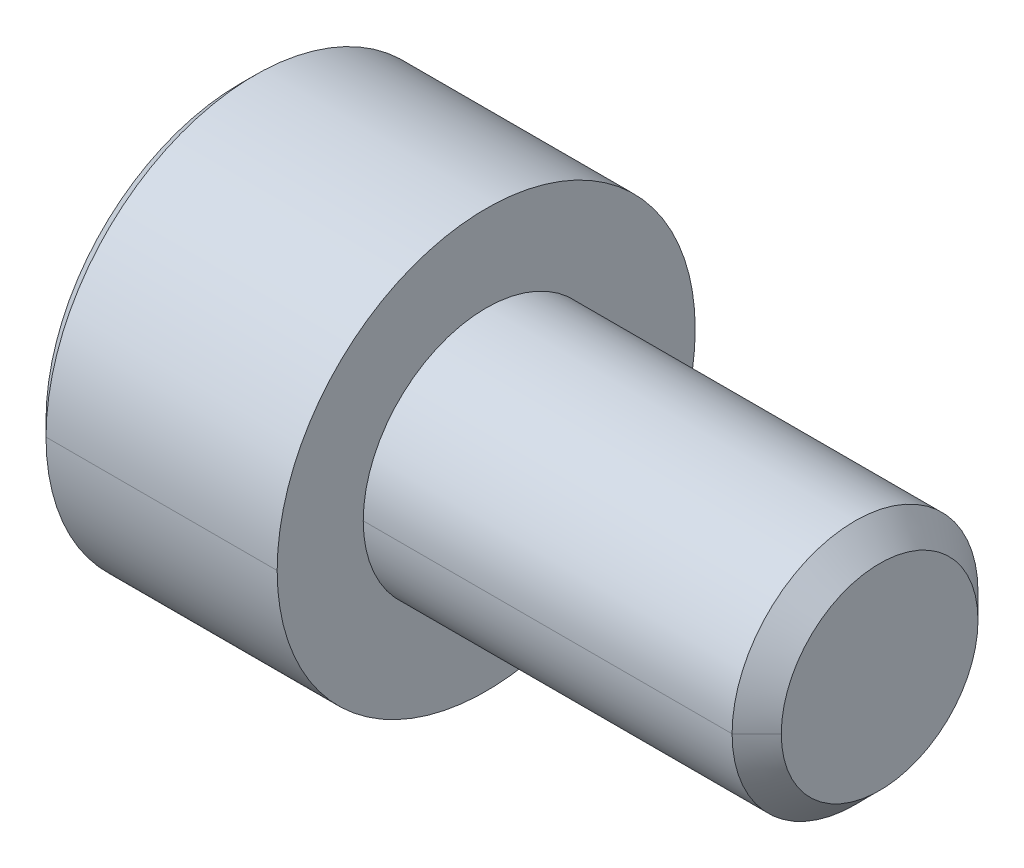
ISO-10303-21;
HEADER;
FILE_DESCRIPTION(('STEP AP214'),'2;1');
FILE_NAME('part.step','',(''),(''),'','','');
FILE_SCHEMA(('AUTOMOTIVE_DESIGN { 1 0 10303 214 1 1 1 1 }'));
ENDSEC;
DATA;
#1=APPLICATION_CONTEXT('core data for automotive mechanical design processes');
#2=APPLICATION_PROTOCOL_DEFINITION('international standard','automotive_design',2000,#1);
#3=PRODUCT_CONTEXT('',#1,'mechanical');
#4=PRODUCT('Part','Part','',(#3));
#5=PRODUCT_RELATED_PRODUCT_CATEGORY('part','',(#4));
#6=PRODUCT_DEFINITION_FORMATION('','',#4);
#7=PRODUCT_DEFINITION_CONTEXT('part definition',#1,'design');
#8=PRODUCT_DEFINITION('design','',#6,#7);
#9=PRODUCT_DEFINITION_SHAPE('','',#8);
#10=(LENGTH_UNIT() NAMED_UNIT(*) SI_UNIT(.MILLI.,.METRE.));
#11=(NAMED_UNIT(*) PLANE_ANGLE_UNIT() SI_UNIT($,.RADIAN.));
#12=(NAMED_UNIT(*) SI_UNIT($,.STERADIAN.) SOLID_ANGLE_UNIT());
#13=UNCERTAINTY_MEASURE_WITH_UNIT(LENGTH_MEASURE(1.E-05),#10,'distance_accuracy_value','');
#14=(GEOMETRIC_REPRESENTATION_CONTEXT(3) GLOBAL_UNCERTAINTY_ASSIGNED_CONTEXT((#13)) GLOBAL_UNIT_ASSIGNED_CONTEXT((#10,
#11,#12)) REPRESENTATION_CONTEXT('',''));
#15=CARTESIAN_POINT('',(0.,0.,0.));
#16=DIRECTION('',(0.,0.,1.));
#17=DIRECTION('',(1.,0.,0.));
#18=AXIS2_PLACEMENT_3D('',#15,#16,#17);
#19=CARTESIAN_POINT('',(-7.6,3.29089653438086,1.9));
#20=DIRECTION('',(0.894427190999916,-0.387298334620742,-0.223606797749979));
#21=DIRECTION('',(0.,0.5,-0.866025403784439));
#22=AXIS2_PLACEMENT_3D('',#19,#20,#21);
#23=PLANE('',#22);
#24=DIRECTION('',(0.397359707119513,0.458831467741124,0.794719414239026));
#25=VECTOR('',#24,1.);
#26=CARTESIAN_POINT('',(-10.5,-1.15470053837925,-2.));
#27=LINE('',#26,#25);
#28=CARTESIAN_POINT('',(-10.5,-1.15470053837925,-2.));
#29=VERTEX_POINT('',#28);
#30=CARTESIAN_POINT('',(-9.5,0.,0.));
#31=VERTEX_POINT('',#30);
#32=EDGE_CURVE('E78',#29,#31,#27,.T.);
#33=ORIENTED_EDGE('',*,*,#32,.F.);
#34=CARTESIAN_POINT('',(-10.5,-1.15470053837925,-2.));
#35=CARTESIAN_POINT('',(-10.5,-1.539600717839,-1.33333333333333));
#36=CARTESIAN_POINT('',(-10.5,-1.92450089729875,-0.666666666666667));
#37=CARTESIAN_POINT('',(-10.5,-2.30940107675851,0.));
#38=(BOUNDED_CURVE() B_SPLINE_CURVE(3,(#34,#35,#36,#37),.UNSPECIFIED.,.F.,
.F.) B_SPLINE_CURVE_WITH_KNOTS((4,4),(0.,1.),
.UNSPECIFIED.) CURVE() GEOMETRIC_REPRESENTATION_ITEM() RATIONAL_B_SPLINE_CURVE((1.,1.,1.,1.)) REPRESENTATION_ITEM(''));
#39=CARTESIAN_POINT('',(-10.5,-2.30940107675851,0.));
#40=VERTEX_POINT('',#39);
#41=EDGE_CURVE('E269',#29,#40,#38,.T.);
#42=ORIENTED_EDGE('',*,*,#41,.T.);
#43=DIRECTION('',(0.397359707119513,0.917662935482247,0.));
#44=VECTOR('',#43,1.);
#45=CARTESIAN_POINT('',(-10.5,-2.30940107675851,0.));
#46=LINE('',#45,#44);
#47=EDGE_CURVE('E10',#40,#31,#46,.T.);
#48=ORIENTED_EDGE('',*,*,#47,.T.);
#49=EDGE_LOOP('',(#33,#42,#48));
#50=FACE_BOUND('',#49,.T.);
#51=ADVANCED_FACE('F16',(#50),#23,.F.);
#52=CARTESIAN_POINT('',(-7.6,3.29089653438086,-1.9));
#53=DIRECTION('',(0.894427190999916,-0.387298334620742,0.223606797749978));
#54=DIRECTION('',(0.,-0.5,-0.866025403784439));
#55=AXIS2_PLACEMENT_3D('',#52,#53,#54);
#56=PLANE('',#55);
#57=ORIENTED_EDGE('',*,*,#47,.F.);
#58=CARTESIAN_POINT('',(-10.5,-2.30940107675851,0.));
#59=CARTESIAN_POINT('',(-10.5,-1.92450089729875,0.666666666666667));
#60=CARTESIAN_POINT('',(-10.5,-1.53960071783901,1.33333333333333));
#61=CARTESIAN_POINT('',(-10.5,-1.15470053837925,2.));
#62=(BOUNDED_CURVE() B_SPLINE_CURVE(3,(#58,#59,#60,#61),.UNSPECIFIED.,.F.,
.F.) B_SPLINE_CURVE_WITH_KNOTS((4,4),(0.,1.),
.UNSPECIFIED.) CURVE() GEOMETRIC_REPRESENTATION_ITEM() RATIONAL_B_SPLINE_CURVE((1.,1.,1.,1.)) REPRESENTATION_ITEM(''));
#63=CARTESIAN_POINT('',(-10.5,-1.15470053837925,2.));
#64=VERTEX_POINT('',#63);
#65=EDGE_CURVE('E262',#40,#64,#62,.T.);
#66=ORIENTED_EDGE('',*,*,#65,.T.);
#67=DIRECTION('',(0.397359707119513,0.458831467741124,-0.794719414239026));
#68=VECTOR('',#67,1.);
#69=CARTESIAN_POINT('',(-10.5,-1.15470053837925,2.));
#70=LINE('',#69,#68);
#71=EDGE_CURVE('E27',#64,#31,#70,.T.);
#72=ORIENTED_EDGE('',*,*,#71,.T.);
#73=EDGE_LOOP('',(#57,#66,#72));
#74=FACE_BOUND('',#73,.T.);
#75=ADVANCED_FACE('F386',(#74),#56,.F.);
#76=CARTESIAN_POINT('',(-7.6,0.,-3.8));
#77=DIRECTION('',(0.894427190999916,0.,0.447213595499958));
#78=DIRECTION('',(0.,-1.,0.));
#79=AXIS2_PLACEMENT_3D('',#76,#77,#78);
#80=PLANE('',#79);
#81=ORIENTED_EDGE('',*,*,#71,.F.);
#82=CARTESIAN_POINT('',(-10.5,-1.15470053837925,2.));
#83=CARTESIAN_POINT('',(-10.5,-0.384900179459752,2.));
#84=CARTESIAN_POINT('',(-10.5,0.38490017945975,2.));
#85=CARTESIAN_POINT('',(-10.5,1.15470053837925,2.));
#86=(BOUNDED_CURVE() B_SPLINE_CURVE(3,(#82,#83,#84,#85),.UNSPECIFIED.,.F.,
.F.) B_SPLINE_CURVE_WITH_KNOTS((4,4),(0.,1.),
.UNSPECIFIED.) CURVE() GEOMETRIC_REPRESENTATION_ITEM() RATIONAL_B_SPLINE_CURVE((1.,1.,1.,1.)) REPRESENTATION_ITEM(''));
#87=CARTESIAN_POINT('',(-10.5,1.15470053837925,2.));
#88=VERTEX_POINT('',#87);
#89=EDGE_CURVE('E261',#64,#88,#86,.T.);
#90=ORIENTED_EDGE('',*,*,#89,.T.);
#91=DIRECTION('',(0.397359707119513,-0.458831467741124,-0.794719414239026));
#92=VECTOR('',#91,1.);
#93=CARTESIAN_POINT('',(-10.5,1.15470053837925,2.));
#94=LINE('',#93,#92);
#95=EDGE_CURVE('E130',#88,#31,#94,.T.);
#96=ORIENTED_EDGE('',*,*,#95,.T.);
#97=EDGE_LOOP('',(#81,#90,#96));
#98=FACE_BOUND('',#97,.T.);
#99=ADVANCED_FACE('F371',(#98),#80,.F.);
#100=CARTESIAN_POINT('',(-7.6,-3.29089653438086,-1.9));
#101=DIRECTION('',(0.894427190999916,0.387298334620742,0.223606797749979));
#102=DIRECTION('',(0.,0.5,-0.866025403784439));
#103=AXIS2_PLACEMENT_3D('',#100,#101,#102);
#104=PLANE('',#103);
#105=ORIENTED_EDGE('',*,*,#95,.F.);
#106=CARTESIAN_POINT('',(-10.5,1.15470053837925,2.));
#107=CARTESIAN_POINT('',(-10.5,1.53960071783901,1.33333333333333));
#108=CARTESIAN_POINT('',(-10.5,1.92450089729875,0.666666666666667));
#109=CARTESIAN_POINT('',(-10.5,2.30940107675851,0.));
#110=(BOUNDED_CURVE() B_SPLINE_CURVE(3,(#106,#107,#108,#109),.UNSPECIFIED.,.F.,
.F.) B_SPLINE_CURVE_WITH_KNOTS((4,4),(0.,1.),
.UNSPECIFIED.) CURVE() GEOMETRIC_REPRESENTATION_ITEM() RATIONAL_B_SPLINE_CURVE((1.,1.,1.,1.)) REPRESENTATION_ITEM(''));
#111=CARTESIAN_POINT('',(-10.5,2.30940107675851,0.));
#112=VERTEX_POINT('',#111);
#113=EDGE_CURVE('E167',#88,#112,#110,.T.);
#114=ORIENTED_EDGE('',*,*,#113,.T.);
#115=DIRECTION('',(0.397359707119513,-0.917662935482247,0.));
#116=VECTOR('',#115,1.);
#117=CARTESIAN_POINT('',(-10.5,2.30940107675851,0.));
#118=LINE('',#117,#116);
#119=EDGE_CURVE('E141',#112,#31,#118,.T.);
#120=ORIENTED_EDGE('',*,*,#119,.T.);
#121=EDGE_LOOP('',(#105,#114,#120));
#122=FACE_BOUND('',#121,.T.);
#123=ADVANCED_FACE('F374',(#122),#104,.F.);
#124=CARTESIAN_POINT('',(-7.6,0.,3.8));
#125=DIRECTION('',(0.894427190999916,0.,-0.447213595499958));
#126=DIRECTION('',(0.,-1.,0.));
#127=AXIS2_PLACEMENT_3D('',#124,#125,#126);
#128=PLANE('',#127);
#129=DIRECTION('',(0.397359707119513,-0.458831467741124,0.794719414239026));
#130=VECTOR('',#129,1.);
#131=CARTESIAN_POINT('',(-10.5,1.15470053837925,-2.));
#132=LINE('',#131,#130);
#133=CARTESIAN_POINT('',(-10.5,1.15470053837925,-2.));
#134=VERTEX_POINT('',#133);
#135=EDGE_CURVE('E307',#134,#31,#132,.T.);
#136=ORIENTED_EDGE('',*,*,#135,.F.);
#137=CARTESIAN_POINT('',(-10.5,1.15470053837925,-2.));
#138=CARTESIAN_POINT('',(-10.5,0.384900179459751,-2.));
#139=CARTESIAN_POINT('',(-10.5,-0.384900179459751,-2.));
#140=CARTESIAN_POINT('',(-10.5,-1.15470053837925,-2.));
#141=(BOUNDED_CURVE() B_SPLINE_CURVE(3,(#137,#138,#139,#140),.UNSPECIFIED.,.F.,
.F.) B_SPLINE_CURVE_WITH_KNOTS((4,4),(0.,1.),
.UNSPECIFIED.) CURVE() GEOMETRIC_REPRESENTATION_ITEM() RATIONAL_B_SPLINE_CURVE((1.,1.,1.,1.)) REPRESENTATION_ITEM(''));
#142=EDGE_CURVE('E317',#134,#29,#141,.T.);
#143=ORIENTED_EDGE('',*,*,#142,.T.);
#144=ORIENTED_EDGE('',*,*,#32,.T.);
#145=EDGE_LOOP('',(#136,#143,#144));
#146=FACE_BOUND('',#145,.T.);
#147=ADVANCED_FACE('F376',(#146),#128,.F.);
#148=CARTESIAN_POINT('',(-7.6,-3.29089653438086,1.9));
#149=DIRECTION('',(0.894427190999916,0.387298334620742,-0.223606797749979));
#150=DIRECTION('',(0.,-0.5,-0.866025403784439));
#151=AXIS2_PLACEMENT_3D('',#148,#149,#150);
#152=PLANE('',#151);
#153=ORIENTED_EDGE('',*,*,#119,.F.);
#154=CARTESIAN_POINT('',(-10.5,2.30940107675851,0.));
#155=CARTESIAN_POINT('',(-10.5,1.92450089729875,-0.666666666666667));
#156=CARTESIAN_POINT('',(-10.5,1.539600717839,-1.33333333333333));
#157=CARTESIAN_POINT('',(-10.5,1.15470053837925,-2.));
#158=(BOUNDED_CURVE() B_SPLINE_CURVE(3,(#154,#155,#156,#157),.UNSPECIFIED.,.F.,
.F.) B_SPLINE_CURVE_WITH_KNOTS((4,4),(0.,1.),
.UNSPECIFIED.) CURVE() GEOMETRIC_REPRESENTATION_ITEM() RATIONAL_B_SPLINE_CURVE((1.,1.,1.,1.)) REPRESENTATION_ITEM(''));
#159=EDGE_CURVE('E163',#112,#134,#158,.T.);
#160=ORIENTED_EDGE('',*,*,#159,.T.);
#161=ORIENTED_EDGE('',*,*,#135,.T.);
#162=EDGE_LOOP('',(#153,#160,#161));
#163=FACE_BOUND('',#162,.T.);
#164=ADVANCED_FACE('F383',(#163),#152,.F.);
#165=CARTESIAN_POINT('',(-13.,0.,0.));
#166=DIRECTION('',(1.,0.,0.));
#167=DIRECTION('',(0.,0.,-1.));
#168=AXIS2_PLACEMENT_3D('',#165,#166,#167);
#169=CONICAL_SURFACE('',#168,3.95,0.785398163397448);
#170=DIRECTION('',(0.707106781186548,0.,0.707106781186548));
#171=VECTOR('',#170,1.);
#172=CARTESIAN_POINT('',(-13.,0.,3.95));
#173=LINE('',#172,#171);
#174=CARTESIAN_POINT('',(-13.,0.,3.95));
#175=VERTEX_POINT('',#174);
#176=CARTESIAN_POINT('',(-12.7,0.,4.25));
#177=VERTEX_POINT('',#176);
#178=EDGE_CURVE('E229',#175,#177,#173,.T.);
#179=ORIENTED_EDGE('',*,*,#178,.F.);
#180=CARTESIAN_POINT('',(-13.,0.,0.));
#181=DIRECTION('',(-1.,0.,0.));
#182=DIRECTION('',(0.,0.,-1.));
#183=AXIS2_PLACEMENT_3D('',#180,#181,#182);
#184=CIRCLE('',#183,3.95);
#185=CARTESIAN_POINT('',(-13.,0.,-3.95));
#186=VERTEX_POINT('',#185);
#187=EDGE_CURVE('E187',#186,#175,#184,.T.);
#188=ORIENTED_EDGE('',*,*,#187,.F.);
#189=DIRECTION('',(0.707106781186548,0.,-0.707106781186548));
#190=VECTOR('',#189,1.);
#191=CARTESIAN_POINT('',(-13.,0.,-3.95));
#192=LINE('',#191,#190);
#193=CARTESIAN_POINT('',(-12.7,0.,-4.25));
#194=VERTEX_POINT('',#193);
#195=EDGE_CURVE('E213',#186,#194,#192,.T.);
#196=ORIENTED_EDGE('',*,*,#195,.T.);
#197=CARTESIAN_POINT('',(-12.7,0.,0.));
#198=DIRECTION('',(1.,0.,0.));
#199=DIRECTION('',(0.,0.,-1.));
#200=AXIS2_PLACEMENT_3D('',#197,#198,#199);
#201=CIRCLE('',#200,4.25);
#202=EDGE_CURVE('E193',#177,#194,#201,.T.);
#203=ORIENTED_EDGE('',*,*,#202,.F.);
#204=EDGE_LOOP('',(#179,#188,#196,#203));
#205=FACE_BOUND('',#204,.T.);
#206=ADVANCED_FACE('F407',(#205),#169,.T.);
#207=CARTESIAN_POINT('',(-10.5,2.30940107675851,0.));
#208=DIRECTION('',(0.,0.866025403784439,-0.5));
#209=DIRECTION('',(-1.,0.,0.));
#210=AXIS2_PLACEMENT_3D('',#207,#208,#209);
#211=PLANE('',#210);
#212=DIRECTION('',(0.,-0.5,-0.866025403784439));
#213=VECTOR('',#212,1.);
#214=CARTESIAN_POINT('',(-13.,2.30940107675851,0.));
#215=LINE('',#214,#213);
#216=CARTESIAN_POINT('',(-13.,2.30940107675851,0.));
#217=VERTEX_POINT('',#216);
#218=CARTESIAN_POINT('',(-13.,1.15470053837925,-2.));
#219=VERTEX_POINT('',#218);
#220=EDGE_CURVE('E162',#217,#219,#215,.T.);
#221=ORIENTED_EDGE('',*,*,#220,.T.);
#222=DIRECTION('',(-1.,0.,0.));
#223=VECTOR('',#222,1.);
#224=CARTESIAN_POINT('',(-10.5,1.15470053837925,-2.));
#225=LINE('',#224,#223);
#226=EDGE_CURVE('E285',#134,#219,#225,.T.);
#227=ORIENTED_EDGE('',*,*,#226,.F.);
#228=ORIENTED_EDGE('',*,*,#159,.F.);
#229=DIRECTION('',(-1.,0.,0.));
#230=VECTOR('',#229,1.);
#231=CARTESIAN_POINT('',(-10.5,2.30940107675851,0.));
#232=LINE('',#231,#230);
#233=EDGE_CURVE('E157',#112,#217,#232,.T.);
#234=ORIENTED_EDGE('',*,*,#233,.T.);
#235=EDGE_LOOP('',(#221,#227,#228,#234));
#236=FACE_BOUND('',#235,.T.);
#237=ADVANCED_FACE('F159',(#236),#211,.F.);
#238=CARTESIAN_POINT('',(-10.5,1.15470053837925,-2.));
#239=DIRECTION('',(0.,0.,-1.));
#240=DIRECTION('',(0.,-1.,0.));
#241=AXIS2_PLACEMENT_3D('',#238,#239,#240);
#242=PLANE('',#241);
#243=DIRECTION('',(0.,-1.,0.));
#244=VECTOR('',#243,1.);
#245=CARTESIAN_POINT('',(-13.,1.15470053837925,-2.));
#246=LINE('',#245,#244);
#247=CARTESIAN_POINT('',(-13.,-1.15470053837925,-2.));
#248=VERTEX_POINT('',#247);
#249=EDGE_CURVE('E168',#219,#248,#246,.T.);
#250=ORIENTED_EDGE('',*,*,#249,.T.);
#251=DIRECTION('',(-1.,0.,0.));
#252=VECTOR('',#251,1.);
#253=CARTESIAN_POINT('',(-10.5,-1.15470053837925,-2.));
#254=LINE('',#253,#252);
#255=EDGE_CURVE('E277',#29,#248,#254,.T.);
#256=ORIENTED_EDGE('',*,*,#255,.F.);
#257=ORIENTED_EDGE('',*,*,#142,.F.);
#258=ORIENTED_EDGE('',*,*,#226,.T.);
#259=EDGE_LOOP('',(#250,#256,#257,#258));
#260=FACE_BOUND('',#259,.T.);
#261=ADVANCED_FACE('F431',(#260),#242,.F.);
#262=CARTESIAN_POINT('',(-10.5,-1.15470053837925,-2.));
#263=DIRECTION('',(0.,-0.866025403784439,-0.5));
#264=DIRECTION('',(0.,0.5,-0.866025403784439));
#265=AXIS2_PLACEMENT_3D('',#262,#263,#264);
#266=PLANE('',#265);
#267=DIRECTION('',(0.,-0.5,0.866025403784439));
#268=VECTOR('',#267,1.);
#269=CARTESIAN_POINT('',(-13.,-1.15470053837925,-2.));
#270=LINE('',#269,#268);
#271=CARTESIAN_POINT('',(-13.,-2.30940107675851,0.));
#272=VERTEX_POINT('',#271);
#273=EDGE_CURVE('E242',#248,#272,#270,.T.);
#274=ORIENTED_EDGE('',*,*,#273,.T.);
#275=DIRECTION('',(-1.,0.,0.));
#276=VECTOR('',#275,1.);
#277=CARTESIAN_POINT('',(-10.5,-2.30940107675851,0.));
#278=LINE('',#277,#276);
#279=EDGE_CURVE('E267',#40,#272,#278,.T.);
#280=ORIENTED_EDGE('',*,*,#279,.F.);
#281=ORIENTED_EDGE('',*,*,#41,.F.);
#282=ORIENTED_EDGE('',*,*,#255,.T.);
#283=EDGE_LOOP('',(#274,#280,#281,#282));
#284=FACE_BOUND('',#283,.T.);
#285=ADVANCED_FACE('F404',(#284),#266,.F.);
#286=CARTESIAN_POINT('',(-10.5,-2.30940107675851,0.));
#287=DIRECTION('',(0.,-0.866025403784439,0.5));
#288=DIRECTION('',(-1.,0.,0.));
#289=AXIS2_PLACEMENT_3D('',#286,#287,#288);
#290=PLANE('',#289);
#291=DIRECTION('',(0.,0.5,0.866025403784439));
#292=VECTOR('',#291,1.);
#293=CARTESIAN_POINT('',(-13.,-2.30940107675851,0.));
#294=LINE('',#293,#292);
#295=CARTESIAN_POINT('',(-13.,-1.15470053837925,2.));
#296=VERTEX_POINT('',#295);
#297=EDGE_CURVE('E234',#272,#296,#294,.T.);
#298=ORIENTED_EDGE('',*,*,#297,.T.);
#299=DIRECTION('',(-1.,0.,0.));
#300=VECTOR('',#299,1.);
#301=CARTESIAN_POINT('',(-10.5,-1.15470053837925,2.));
#302=LINE('',#301,#300);
#303=EDGE_CURVE('E268',#64,#296,#302,.T.);
#304=ORIENTED_EDGE('',*,*,#303,.F.);
#305=ORIENTED_EDGE('',*,*,#65,.F.);
#306=ORIENTED_EDGE('',*,*,#279,.T.);
#307=EDGE_LOOP('',(#298,#304,#305,#306));
#308=FACE_BOUND('',#307,.T.);
#309=ADVANCED_FACE('F401',(#308),#290,.F.);
#310=CARTESIAN_POINT('',(-10.5,-1.15470053837925,2.));
#311=DIRECTION('',(0.,0.,1.));
#312=DIRECTION('',(0.,-1.,0.));
#313=AXIS2_PLACEMENT_3D('',#310,#311,#312);
#314=PLANE('',#313);
#315=DIRECTION('',(0.,1.,0.));
#316=VECTOR('',#315,1.);
#317=CARTESIAN_POINT('',(-13.,-1.15470053837925,2.));
#318=LINE('',#317,#316);
#319=CARTESIAN_POINT('',(-13.,1.15470053837925,2.));
#320=VERTEX_POINT('',#319);
#321=EDGE_CURVE('E179',#296,#320,#318,.T.);
#322=ORIENTED_EDGE('',*,*,#321,.T.);
#323=DIRECTION('',(-1.,0.,0.));
#324=VECTOR('',#323,1.);
#325=CARTESIAN_POINT('',(-10.5,1.15470053837925,2.));
#326=LINE('',#325,#324);
#327=EDGE_CURVE('E174',#88,#320,#326,.T.);
#328=ORIENTED_EDGE('',*,*,#327,.F.);
#329=ORIENTED_EDGE('',*,*,#89,.F.);
#330=ORIENTED_EDGE('',*,*,#303,.T.);
#331=EDGE_LOOP('',(#322,#328,#329,#330));
#332=FACE_BOUND('',#331,.T.);
#333=ADVANCED_FACE('F373',(#332),#314,.F.);
#334=CARTESIAN_POINT('',(-10.5,1.15470053837925,2.));
#335=DIRECTION('',(0.,0.866025403784439,0.5));
#336=DIRECTION('',(1.,0.,0.));
#337=AXIS2_PLACEMENT_3D('',#334,#335,#336);
#338=PLANE('',#337);
#339=DIRECTION('',(0.,0.5,-0.866025403784439));
#340=VECTOR('',#339,1.);
#341=CARTESIAN_POINT('',(-13.,1.15470053837925,2.));
#342=LINE('',#341,#340);
#343=EDGE_CURVE('E171',#320,#217,#342,.T.);
#344=ORIENTED_EDGE('',*,*,#343,.T.);
#345=ORIENTED_EDGE('',*,*,#233,.F.);
#346=ORIENTED_EDGE('',*,*,#113,.F.);
#347=ORIENTED_EDGE('',*,*,#327,.T.);
#348=EDGE_LOOP('',(#344,#345,#346,#347));
#349=FACE_BOUND('',#348,.T.);
#350=ADVANCED_FACE('F172',(#349),#338,.F.);
#351=CARTESIAN_POINT('',(-0.5,0.,0.));
#352=DIRECTION('',(-1.,0.,0.));
#353=DIRECTION('',(0.,0.,1.));
#354=AXIS2_PLACEMENT_3D('',#351,#352,#353);
#355=CONICAL_SURFACE('',#354,2.5,0.78539816339745);
#356=DIRECTION('',(-0.707106781186546,0.,-0.707106781186549));
#357=VECTOR('',#356,1.);
#358=CARTESIAN_POINT('',(-0.5,0.,-2.5));
#359=LINE('',#358,#357);
#360=CARTESIAN_POINT('',(0.,0.,-2.));
#361=VERTEX_POINT('',#360);
#362=CARTESIAN_POINT('',(-0.5,0.,-2.5));
#363=VERTEX_POINT('',#362);
#364=EDGE_CURVE('E212',#361,#363,#359,.T.);
#365=ORIENTED_EDGE('',*,*,#364,.F.);
#366=CARTESIAN_POINT('',(0.,0.,0.));
#367=DIRECTION('',(1.,0.,0.));
#368=DIRECTION('',(0.,0.,1.));
#369=AXIS2_PLACEMENT_3D('',#366,#367,#368);
#370=CIRCLE('',#369,2.);
#371=CARTESIAN_POINT('',(0.,0.,2.));
#372=VERTEX_POINT('',#371);
#373=EDGE_CURVE('E218',#372,#361,#370,.T.);
#374=ORIENTED_EDGE('',*,*,#373,.F.);
#375=DIRECTION('',(-0.707106781186546,0.,0.707106781186549));
#376=VECTOR('',#375,1.);
#377=CARTESIAN_POINT('',(-0.5,0.,2.5));
#378=LINE('',#377,#376);
#379=CARTESIAN_POINT('',(-0.5,0.,2.5));
#380=VERTEX_POINT('',#379);
#381=EDGE_CURVE('E203',#372,#380,#378,.T.);
#382=ORIENTED_EDGE('',*,*,#381,.T.);
#383=CARTESIAN_POINT('',(-0.5,0.,0.));
#384=DIRECTION('',(-1.,0.,0.));
#385=DIRECTION('',(0.,0.,1.));
#386=AXIS2_PLACEMENT_3D('',#383,#384,#385);
#387=CIRCLE('',#386,2.5);
#388=EDGE_CURVE('E207',#363,#380,#387,.T.);
#389=ORIENTED_EDGE('',*,*,#388,.F.);
#390=EDGE_LOOP('',(#365,#374,#382,#389));
#391=FACE_BOUND('',#390,.T.);
#392=ADVANCED_FACE('F345',(#391),#355,.T.);
#393=CARTESIAN_POINT('',(-13.,4.25,0.));
#394=DIRECTION('',(1.,0.,0.));
#395=DIRECTION('',(0.,1.,0.));
#396=AXIS2_PLACEMENT_3D('',#393,#394,#395);
#397=PLANE('',#396);
#398=ORIENTED_EDGE('',*,*,#220,.F.);
#399=ORIENTED_EDGE('',*,*,#343,.F.);
#400=ORIENTED_EDGE('',*,*,#321,.F.);
#401=ORIENTED_EDGE('',*,*,#297,.F.);
#402=ORIENTED_EDGE('',*,*,#273,.F.);
#403=ORIENTED_EDGE('',*,*,#249,.F.);
#404=EDGE_LOOP('',(#398,#399,#400,#401,#402,#403));
#405=FACE_BOUND('',#404,.T.);
#406=ORIENTED_EDGE('',*,*,#187,.T.);
#407=CARTESIAN_POINT('',(-13.,0.,0.));
#408=DIRECTION('',(-1.,0.,0.));
#409=DIRECTION('',(0.,0.,-1.));
#410=AXIS2_PLACEMENT_3D('',#407,#408,#409);
#411=CIRCLE('',#410,3.95);
#412=EDGE_CURVE('E238',#175,#186,#411,.T.);
#413=ORIENTED_EDGE('',*,*,#412,.T.);
#414=EDGE_LOOP('',(#406,#413));
#415=FACE_BOUND('',#414,.T.);
#416=ADVANCED_FACE('F182',(#405,#415),#397,.F.);
#417=CARTESIAN_POINT('',(0.,0.,0.));
#418=DIRECTION('',(-1.,0.,0.));
#419=DIRECTION('',(0.,0.,1.));
#420=AXIS2_PLACEMENT_3D('',#417,#418,#419);
#421=CYLINDRICAL_SURFACE('',#420,4.25);
#422=DIRECTION('',(-1.,0.,0.));
#423=VECTOR('',#422,1.);
#424=CARTESIAN_POINT('',(0.,0.,-4.25));
#425=LINE('',#424,#423);
#426=CARTESIAN_POINT('',(-8.,0.,-4.25));
#427=VERTEX_POINT('',#426);
#428=EDGE_CURVE('E202',#427,#194,#425,.T.);
#429=ORIENTED_EDGE('',*,*,#428,.F.);
#430=CARTESIAN_POINT('',(-8.,0.,0.));
#431=DIRECTION('',(-1.,0.,0.));
#432=DIRECTION('',(0.,0.,1.));
#433=AXIS2_PLACEMENT_3D('',#430,#431,#432);
#434=CIRCLE('',#433,4.25);
#435=CARTESIAN_POINT('',(-8.,0.,4.25));
#436=VERTEX_POINT('',#435);
#437=EDGE_CURVE('E20',#427,#436,#434,.T.);
#438=ORIENTED_EDGE('',*,*,#437,.T.);
#439=DIRECTION('',(-1.,0.,0.));
#440=VECTOR('',#439,1.);
#441=CARTESIAN_POINT('',(0.,0.,4.25));
#442=LINE('',#441,#440);
#443=EDGE_CURVE('E258',#436,#177,#442,.T.);
#444=ORIENTED_EDGE('',*,*,#443,.T.);
#445=ORIENTED_EDGE('',*,*,#202,.T.);
#446=EDGE_LOOP('',(#429,#438,#444,#445));
#447=FACE_BOUND('',#446,.T.);
#448=ADVANCED_FACE('F411',(#447),#421,.T.);
#449=CARTESIAN_POINT('',(-8.,2.5,0.));
#450=DIRECTION('',(-1.,0.,0.));
#451=DIRECTION('',(0.,0.,1.));
#452=AXIS2_PLACEMENT_3D('',#449,#450,#451);
#453=PLANE('',#452);
#454=CARTESIAN_POINT('',(-8.,0.,0.));
#455=DIRECTION('',(-1.,0.,0.));
#456=DIRECTION('',(0.,0.,1.));
#457=AXIS2_PLACEMENT_3D('',#454,#455,#456);
#458=CIRCLE('',#457,2.5);
#459=CARTESIAN_POINT('',(-8.,0.,2.5));
#460=VERTEX_POINT('',#459);
#461=CARTESIAN_POINT('',(-8.,0.,-2.5));
#462=VERTEX_POINT('',#461);
#463=EDGE_CURVE('E219',#460,#462,#458,.T.);
#464=ORIENTED_EDGE('',*,*,#463,.T.);
#465=CARTESIAN_POINT('',(-8.,0.,0.));
#466=DIRECTION('',(-1.,0.,0.));
#467=DIRECTION('',(0.,0.,1.));
#468=AXIS2_PLACEMENT_3D('',#465,#466,#467);
#469=CIRCLE('',#468,2.5);
#470=EDGE_CURVE('E204',#462,#460,#469,.T.);
#471=ORIENTED_EDGE('',*,*,#470,.T.);
#472=EDGE_LOOP('',(#464,#471));
#473=FACE_BOUND('',#472,.T.);
#474=CARTESIAN_POINT('',(-8.,0.,0.));
#475=DIRECTION('',(-1.,0.,0.));
#476=DIRECTION('',(0.,0.,1.));
#477=AXIS2_PLACEMENT_3D('',#474,#475,#476);
#478=CIRCLE('',#477,4.25);
#479=EDGE_CURVE('E198',#436,#427,#478,.T.);
#480=ORIENTED_EDGE('',*,*,#479,.F.);
#481=ORIENTED_EDGE('',*,*,#437,.F.);
#482=EDGE_LOOP('',(#480,#481));
#483=FACE_BOUND('',#482,.T.);
#484=ADVANCED_FACE('F331',(#473,#483),#453,.F.);
#485=CARTESIAN_POINT('',(0.,0.,0.));
#486=DIRECTION('',(-1.,0.,0.));
#487=DIRECTION('',(0.,0.,1.));
#488=AXIS2_PLACEMENT_3D('',#485,#486,#487);
#489=CYLINDRICAL_SURFACE('',#488,2.5);
#490=DIRECTION('',(-1.,0.,0.));
#491=VECTOR('',#490,1.);
#492=CARTESIAN_POINT('',(0.,0.,-2.5));
#493=LINE('',#492,#491);
#494=EDGE_CURVE('E292',#363,#462,#493,.T.);
#495=ORIENTED_EDGE('',*,*,#494,.F.);
#496=ORIENTED_EDGE('',*,*,#388,.T.);
#497=DIRECTION('',(-1.,0.,0.));
#498=VECTOR('',#497,1.);
#499=CARTESIAN_POINT('',(0.,0.,2.5));
#500=LINE('',#499,#498);
#501=EDGE_CURVE('E214',#380,#460,#500,.T.);
#502=ORIENTED_EDGE('',*,*,#501,.T.);
#503=ORIENTED_EDGE('',*,*,#470,.F.);
#504=EDGE_LOOP('',(#495,#496,#502,#503));
#505=FACE_BOUND('',#504,.T.);
#506=ADVANCED_FACE('F340',(#505),#489,.T.);
#507=CARTESIAN_POINT('',(0.,0.,0.));
#508=DIRECTION('',(-1.,0.,0.));
#509=DIRECTION('',(0.,0.,1.));
#510=AXIS2_PLACEMENT_3D('',#507,#508,#509);
#511=PLANE('',#510);
#512=ORIENTED_EDGE('',*,*,#373,.T.);
#513=CARTESIAN_POINT('',(0.,0.,0.));
#514=DIRECTION('',(1.,0.,0.));
#515=DIRECTION('',(0.,0.,1.));
#516=AXIS2_PLACEMENT_3D('',#513,#514,#515);
#517=CIRCLE('',#516,2.);
#518=EDGE_CURVE('E208',#361,#372,#517,.T.);
#519=ORIENTED_EDGE('',*,*,#518,.T.);
#520=EDGE_LOOP('',(#512,#519));
#521=FACE_BOUND('',#520,.T.);
#522=ADVANCED_FACE('F18',(#521),#511,.F.);
#523=CARTESIAN_POINT('',(0.,0.,0.));
#524=DIRECTION('',(-1.,0.,0.));
#525=DIRECTION('',(0.,0.,1.));
#526=AXIS2_PLACEMENT_3D('',#523,#524,#525);
#527=CYLINDRICAL_SURFACE('',#526,2.5);
#528=CARTESIAN_POINT('',(-0.5,0.,0.));
#529=DIRECTION('',(-1.,0.,0.));
#530=DIRECTION('',(0.,0.,1.));
#531=AXIS2_PLACEMENT_3D('',#528,#529,#530);
#532=CIRCLE('',#531,2.5);
#533=EDGE_CURVE('E246',#380,#363,#532,.T.);
#534=ORIENTED_EDGE('',*,*,#533,.T.);
#535=ORIENTED_EDGE('',*,*,#494,.T.);
#536=ORIENTED_EDGE('',*,*,#463,.F.);
#537=ORIENTED_EDGE('',*,*,#501,.F.);
#538=EDGE_LOOP('',(#534,#535,#536,#537));
#539=FACE_BOUND('',#538,.T.);
#540=ADVANCED_FACE('F337',(#539),#527,.T.);
#541=CARTESIAN_POINT('',(0.,0.,0.));
#542=DIRECTION('',(-1.,0.,0.));
#543=DIRECTION('',(0.,0.,1.));
#544=AXIS2_PLACEMENT_3D('',#541,#542,#543);
#545=CYLINDRICAL_SURFACE('',#544,4.25);
#546=ORIENTED_EDGE('',*,*,#479,.T.);
#547=ORIENTED_EDGE('',*,*,#428,.T.);
#548=CARTESIAN_POINT('',(-12.7,0.,0.));
#549=DIRECTION('',(1.,0.,0.));
#550=DIRECTION('',(0.,0.,-1.));
#551=AXIS2_PLACEMENT_3D('',#548,#549,#550);
#552=CIRCLE('',#551,4.25);
#553=EDGE_CURVE('E223',#194,#177,#552,.T.);
#554=ORIENTED_EDGE('',*,*,#553,.T.);
#555=ORIENTED_EDGE('',*,*,#443,.F.);
#556=EDGE_LOOP('',(#546,#547,#554,#555));
#557=FACE_BOUND('',#556,.T.);
#558=ADVANCED_FACE('F400',(#557),#545,.T.);
#559=CARTESIAN_POINT('',(-0.5,0.,0.));
#560=DIRECTION('',(-1.,0.,0.));
#561=DIRECTION('',(0.,0.,1.));
#562=AXIS2_PLACEMENT_3D('',#559,#560,#561);
#563=CONICAL_SURFACE('',#562,2.5,0.78539816339745);
#564=ORIENTED_EDGE('',*,*,#518,.F.);
#565=ORIENTED_EDGE('',*,*,#364,.T.);
#566=ORIENTED_EDGE('',*,*,#533,.F.);
#567=ORIENTED_EDGE('',*,*,#381,.F.);
#568=EDGE_LOOP('',(#564,#565,#566,#567));
#569=FACE_BOUND('',#568,.T.);
#570=ADVANCED_FACE('F348',(#569),#563,.T.);
#571=CARTESIAN_POINT('',(-13.,0.,0.));
#572=DIRECTION('',(1.,0.,0.));
#573=DIRECTION('',(0.,0.,-1.));
#574=AXIS2_PLACEMENT_3D('',#571,#572,#573);
#575=CONICAL_SURFACE('',#574,3.95,0.785398163397448);
#576=ORIENTED_EDGE('',*,*,#412,.F.);
#577=ORIENTED_EDGE('',*,*,#178,.T.);
#578=ORIENTED_EDGE('',*,*,#553,.F.);
#579=ORIENTED_EDGE('',*,*,#195,.F.);
#580=EDGE_LOOP('',(#576,#577,#578,#579));
#581=FACE_BOUND('',#580,.T.);
#582=ADVANCED_FACE('F415',(#581),#575,.T.);
#583=CLOSED_SHELL('',(#51,#75,#99,#123,#147,#164,#206,#237,#261,#285,#309,#333,#350,#392,#416,
#448,#484,#506,#522,#540,#558,#570,#582));
#584=MANIFOLD_SOLID_BREP('B1',#583);
#585=ADVANCED_BREP_SHAPE_REPRESENTATION('',(#18,#584),#14);
#586=SHAPE_DEFINITION_REPRESENTATION(#9,#585);
ENDSEC;
END-ISO-10303-21;
